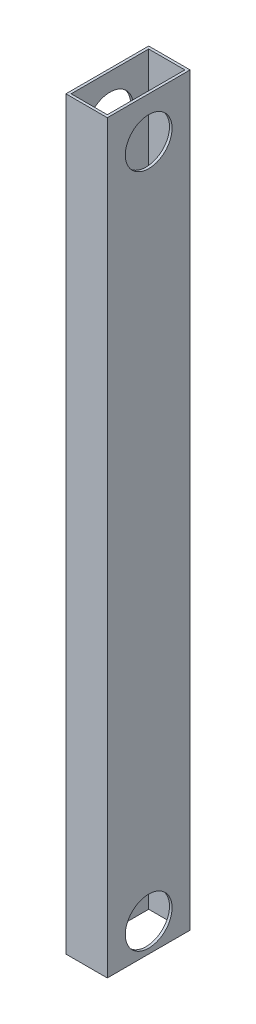
ISO-10303-21;
HEADER;
FILE_DESCRIPTION(('STEP AP214'),'2;1');
FILE_NAME('part.step','',(''),(''),'','','');
FILE_SCHEMA(('AUTOMOTIVE_DESIGN { 1 0 10303 214 1 1 1 1 }'));
ENDSEC;
DATA;
#1=APPLICATION_CONTEXT('core data for automotive mechanical design processes');
#2=APPLICATION_PROTOCOL_DEFINITION('international standard','automotive_design',2000,#1);
#3=PRODUCT_CONTEXT('',#1,'mechanical');
#4=PRODUCT('Part','Part','',(#3));
#5=PRODUCT_RELATED_PRODUCT_CATEGORY('part','',(#4));
#6=PRODUCT_DEFINITION_FORMATION('','',#4);
#7=PRODUCT_DEFINITION_CONTEXT('part definition',#1,'design');
#8=PRODUCT_DEFINITION('design','',#6,#7);
#9=PRODUCT_DEFINITION_SHAPE('','',#8);
#10=(LENGTH_UNIT() NAMED_UNIT(*) SI_UNIT(.MILLI.,.METRE.));
#11=(NAMED_UNIT(*) PLANE_ANGLE_UNIT() SI_UNIT($,.RADIAN.));
#12=(NAMED_UNIT(*) SI_UNIT($,.STERADIAN.) SOLID_ANGLE_UNIT());
#13=UNCERTAINTY_MEASURE_WITH_UNIT(LENGTH_MEASURE(1.E-05),#10,'distance_accuracy_value','');
#14=(GEOMETRIC_REPRESENTATION_CONTEXT(3) GLOBAL_UNCERTAINTY_ASSIGNED_CONTEXT((#13)) GLOBAL_UNIT_ASSIGNED_CONTEXT((#10,
#11,#12)) REPRESENTATION_CONTEXT('',''));
#15=CARTESIAN_POINT('',(0.,0.,0.));
#16=DIRECTION('',(0.,0.,1.));
#17=DIRECTION('',(1.,0.,0.));
#18=AXIS2_PLACEMENT_3D('',#15,#16,#17);
#19=CARTESIAN_POINT('',(0.,457.2,0.));
#20=DIRECTION('',(0.,1.,0.));
#21=DIRECTION('',(0.,0.,1.));
#22=AXIS2_PLACEMENT_3D('',#19,#20,#21);
#23=PLANE('',#22);
#24=DIRECTION('',(0.,0.,1.));
#25=VECTOR('',#24,1.);
#26=CARTESIAN_POINT('',(0.,457.2,0.));
#27=LINE('',#26,#25);
#28=CARTESIAN_POINT('',(0.,457.2,-50.8));
#29=VERTEX_POINT('',#28);
#30=CARTESIAN_POINT('',(0.,457.2,0.));
#31=VERTEX_POINT('',#30);
#32=EDGE_CURVE('E162',#29,#31,#27,.T.);
#33=ORIENTED_EDGE('',*,*,#32,.T.);
#34=DIRECTION('',(1.,0.,0.));
#35=VECTOR('',#34,1.);
#36=CARTESIAN_POINT('',(0.,457.2,0.));
#37=LINE('',#36,#35);
#38=CARTESIAN_POINT('',(25.4,457.2,0.));
#39=VERTEX_POINT('',#38);
#40=EDGE_CURVE('E165',#31,#39,#37,.T.);
#41=ORIENTED_EDGE('',*,*,#40,.T.);
#42=DIRECTION('',(0.,0.,-1.));
#43=VECTOR('',#42,1.);
#44=CARTESIAN_POINT('',(25.4,457.2,0.));
#45=LINE('',#44,#43);
#46=CARTESIAN_POINT('',(25.4,457.2,-50.8));
#47=VERTEX_POINT('',#46);
#48=EDGE_CURVE('E168',#39,#47,#45,.T.);
#49=ORIENTED_EDGE('',*,*,#48,.T.);
#50=DIRECTION('',(-1.,0.,0.));
#51=VECTOR('',#50,1.);
#52=CARTESIAN_POINT('',(0.,457.2,-50.8));
#53=LINE('',#52,#51);
#54=EDGE_CURVE('E170',#47,#29,#53,.T.);
#55=ORIENTED_EDGE('',*,*,#54,.T.);
#56=EDGE_LOOP('',(#33,#41,#49,#55));
#57=FACE_BOUND('',#56,.T.);
#58=DIRECTION('',(1.,0.,0.));
#59=VECTOR('',#58,1.);
#60=CARTESIAN_POINT('',(0.,457.2,-1.5875));
#61=LINE('',#60,#59);
#62=CARTESIAN_POINT('',(1.5875,457.2,-1.5875));
#63=VERTEX_POINT('',#62);
#64=CARTESIAN_POINT('',(23.8125,457.2,-1.5875));
#65=VERTEX_POINT('',#64);
#66=EDGE_CURVE('E132',#63,#65,#61,.T.);
#67=ORIENTED_EDGE('',*,*,#66,.F.);
#68=DIRECTION('',(0.,0.,1.));
#69=VECTOR('',#68,1.);
#70=CARTESIAN_POINT('',(1.5875,457.2,0.));
#71=LINE('',#70,#69);
#72=CARTESIAN_POINT('',(1.5875,457.2,-49.2125));
#73=VERTEX_POINT('',#72);
#74=EDGE_CURVE('E124',#73,#63,#71,.T.);
#75=ORIENTED_EDGE('',*,*,#74,.F.);
#76=DIRECTION('',(-1.,0.,0.));
#77=VECTOR('',#76,1.);
#78=CARTESIAN_POINT('',(0.,457.2,-49.2125));
#79=LINE('',#78,#77);
#80=CARTESIAN_POINT('',(23.8125,457.2,-49.2125));
#81=VERTEX_POINT('',#80);
#82=EDGE_CURVE('E146',#81,#73,#79,.T.);
#83=ORIENTED_EDGE('',*,*,#82,.F.);
#84=DIRECTION('',(0.,0.,-1.));
#85=VECTOR('',#84,1.);
#86=CARTESIAN_POINT('',(23.8125,457.2,0.));
#87=LINE('',#86,#85);
#88=EDGE_CURVE('E144',#65,#81,#87,.T.);
#89=ORIENTED_EDGE('',*,*,#88,.F.);
#90=EDGE_LOOP('',(#67,#75,#83,#89));
#91=FACE_BOUND('',#90,.T.);
#92=ADVANCED_FACE('F57',(#57,#91),#23,.T.);
#93=CARTESIAN_POINT('',(0.,0.,0.));
#94=DIRECTION('',(0.,1.,0.));
#95=DIRECTION('',(0.,0.,1.));
#96=AXIS2_PLACEMENT_3D('',#93,#94,#95);
#97=PLANE('',#96);
#98=DIRECTION('',(0.,0.,1.));
#99=VECTOR('',#98,1.);
#100=CARTESIAN_POINT('',(0.,0.,0.));
#101=LINE('',#100,#99);
#102=CARTESIAN_POINT('',(0.,0.,-50.8));
#103=VERTEX_POINT('',#102);
#104=CARTESIAN_POINT('',(0.,0.,0.));
#105=VERTEX_POINT('',#104);
#106=EDGE_CURVE('E140',#103,#105,#101,.T.);
#107=ORIENTED_EDGE('',*,*,#106,.F.);
#108=DIRECTION('',(-1.,0.,0.));
#109=VECTOR('',#108,1.);
#110=CARTESIAN_POINT('',(0.,0.,-50.8));
#111=LINE('',#110,#109);
#112=CARTESIAN_POINT('',(25.4,0.,-50.8));
#113=VERTEX_POINT('',#112);
#114=EDGE_CURVE('E166',#113,#103,#111,.T.);
#115=ORIENTED_EDGE('',*,*,#114,.F.);
#116=DIRECTION('',(0.,0.,-1.));
#117=VECTOR('',#116,1.);
#118=CARTESIAN_POINT('',(25.4,0.,0.));
#119=LINE('',#118,#117);
#120=CARTESIAN_POINT('',(25.4,0.,0.));
#121=VERTEX_POINT('',#120);
#122=EDGE_CURVE('E177',#121,#113,#119,.T.);
#123=ORIENTED_EDGE('',*,*,#122,.F.);
#124=DIRECTION('',(1.,0.,0.));
#125=VECTOR('',#124,1.);
#126=CARTESIAN_POINT('',(0.,0.,0.));
#127=LINE('',#126,#125);
#128=EDGE_CURVE('E175',#105,#121,#127,.T.);
#129=ORIENTED_EDGE('',*,*,#128,.F.);
#130=EDGE_LOOP('',(#107,#115,#123,#129));
#131=FACE_BOUND('',#130,.T.);
#132=DIRECTION('',(0.,0.,1.));
#133=VECTOR('',#132,1.);
#134=CARTESIAN_POINT('',(1.5875,0.,0.));
#135=LINE('',#134,#133);
#136=CARTESIAN_POINT('',(1.5875,0.,-49.2125));
#137=VERTEX_POINT('',#136);
#138=CARTESIAN_POINT('',(1.5875,0.,-1.5875));
#139=VERTEX_POINT('',#138);
#140=EDGE_CURVE('E82',#137,#139,#135,.T.);
#141=ORIENTED_EDGE('',*,*,#140,.T.);
#142=DIRECTION('',(1.,0.,0.));
#143=VECTOR('',#142,1.);
#144=CARTESIAN_POINT('',(0.,0.,-1.5875));
#145=LINE('',#144,#143);
#146=CARTESIAN_POINT('',(23.8125,0.,-1.5875));
#147=VERTEX_POINT('',#146);
#148=EDGE_CURVE('E139',#139,#147,#145,.T.);
#149=ORIENTED_EDGE('',*,*,#148,.T.);
#150=DIRECTION('',(0.,0.,-1.));
#151=VECTOR('',#150,1.);
#152=CARTESIAN_POINT('',(23.8125,0.,0.));
#153=LINE('',#152,#151);
#154=CARTESIAN_POINT('',(23.8125,0.,-49.2125));
#155=VERTEX_POINT('',#154);
#156=EDGE_CURVE('E154',#147,#155,#153,.T.);
#157=ORIENTED_EDGE('',*,*,#156,.T.);
#158=DIRECTION('',(-1.,0.,0.));
#159=VECTOR('',#158,1.);
#160=CARTESIAN_POINT('',(0.,0.,-49.2125));
#161=LINE('',#160,#159);
#162=EDGE_CURVE('E133',#155,#137,#161,.T.);
#163=ORIENTED_EDGE('',*,*,#162,.T.);
#164=EDGE_LOOP('',(#141,#149,#157,#163));
#165=FACE_BOUND('',#164,.T.);
#166=ADVANCED_FACE('F224',(#131,#165),#97,.F.);
#167=CARTESIAN_POINT('',(0.,457.2,0.));
#168=DIRECTION('',(1.,0.,0.));
#169=DIRECTION('',(0.,0.,-1.));
#170=AXIS2_PLACEMENT_3D('',#167,#168,#169);
#171=PLANE('',#170);
#172=CARTESIAN_POINT('',(0.,431.8,-25.4));
#173=DIRECTION('',(1.,0.,0.));
#174=DIRECTION('',(0.,0.,-1.));
#175=AXIS2_PLACEMENT_3D('',#172,#173,#174);
#176=CIRCLE('',#175,14.351);
#177=CARTESIAN_POINT('',(0.,431.8,-39.751));
#178=VERTEX_POINT('',#177);
#179=EDGE_CURVE('E206',#178,#178,#176,.T.);
#180=ORIENTED_EDGE('',*,*,#179,.T.);
#181=EDGE_LOOP('',(#180));
#182=FACE_BOUND('',#181,.T.);
#183=CARTESIAN_POINT('',(0.,17.526,-25.4));
#184=DIRECTION('',(1.,0.,0.));
#185=DIRECTION('',(0.,0.,-1.));
#186=AXIS2_PLACEMENT_3D('',#183,#184,#185);
#187=CIRCLE('',#186,14.351);
#188=CARTESIAN_POINT('',(0.,17.526,-39.751));
#189=VERTEX_POINT('',#188);
#190=EDGE_CURVE('E188',#189,#189,#187,.T.);
#191=ORIENTED_EDGE('',*,*,#190,.T.);
#192=EDGE_LOOP('',(#191));
#193=FACE_BOUND('',#192,.T.);
#194=ORIENTED_EDGE('',*,*,#106,.T.);
#195=DIRECTION('',(0.,-1.,0.));
#196=VECTOR('',#195,1.);
#197=CARTESIAN_POINT('',(0.,457.2,0.));
#198=LINE('',#197,#196);
#199=EDGE_CURVE('E12',#31,#105,#198,.T.);
#200=ORIENTED_EDGE('',*,*,#199,.F.);
#201=ORIENTED_EDGE('',*,*,#32,.F.);
#202=DIRECTION('',(0.,-1.,0.));
#203=VECTOR('',#202,1.);
#204=CARTESIAN_POINT('',(0.,457.2,-50.8));
#205=LINE('',#204,#203);
#206=EDGE_CURVE('E172',#29,#103,#205,.T.);
#207=ORIENTED_EDGE('',*,*,#206,.T.);
#208=EDGE_LOOP('',(#194,#200,#201,#207));
#209=FACE_BOUND('',#208,.T.);
#210=ADVANCED_FACE('F59',(#182,#193,#209),#171,.F.);
#211=CARTESIAN_POINT('',(0.,457.2,0.));
#212=DIRECTION('',(0.,0.,-1.));
#213=DIRECTION('',(-1.,0.,0.));
#214=AXIS2_PLACEMENT_3D('',#211,#212,#213);
#215=PLANE('',#214);
#216=ORIENTED_EDGE('',*,*,#128,.T.);
#217=DIRECTION('',(0.,-1.,0.));
#218=VECTOR('',#217,1.);
#219=CARTESIAN_POINT('',(25.4,457.2,0.));
#220=LINE('',#219,#218);
#221=EDGE_CURVE('E66',#39,#121,#220,.T.);
#222=ORIENTED_EDGE('',*,*,#221,.F.);
#223=ORIENTED_EDGE('',*,*,#40,.F.);
#224=ORIENTED_EDGE('',*,*,#199,.T.);
#225=EDGE_LOOP('',(#216,#222,#223,#224));
#226=FACE_BOUND('',#225,.T.);
#227=ADVANCED_FACE('F250',(#226),#215,.F.);
#228=CARTESIAN_POINT('',(25.4,457.2,0.));
#229=DIRECTION('',(-1.,0.,0.));
#230=DIRECTION('',(0.,0.,1.));
#231=AXIS2_PLACEMENT_3D('',#228,#229,#230);
#232=PLANE('',#231);
#233=CARTESIAN_POINT('',(25.4,431.8,-25.4));
#234=DIRECTION('',(1.,0.,0.));
#235=DIRECTION('',(0.,0.,-1.));
#236=AXIS2_PLACEMENT_3D('',#233,#234,#235);
#237=CIRCLE('',#236,14.351);
#238=CARTESIAN_POINT('',(25.4,431.8,-39.751));
#239=VERTEX_POINT('',#238);
#240=EDGE_CURVE('E203',#239,#239,#237,.T.);
#241=ORIENTED_EDGE('',*,*,#240,.F.);
#242=EDGE_LOOP('',(#241));
#243=FACE_BOUND('',#242,.T.);
#244=CARTESIAN_POINT('',(25.4,17.526,-25.4));
#245=DIRECTION('',(1.,0.,0.));
#246=DIRECTION('',(0.,0.,-1.));
#247=AXIS2_PLACEMENT_3D('',#244,#245,#246);
#248=CIRCLE('',#247,14.351);
#249=CARTESIAN_POINT('',(25.4,17.526,-39.751));
#250=VERTEX_POINT('',#249);
#251=EDGE_CURVE('E193',#250,#250,#248,.T.);
#252=ORIENTED_EDGE('',*,*,#251,.F.);
#253=EDGE_LOOP('',(#252));
#254=FACE_BOUND('',#253,.T.);
#255=ORIENTED_EDGE('',*,*,#122,.T.);
#256=DIRECTION('',(0.,-1.,0.));
#257=VECTOR('',#256,1.);
#258=CARTESIAN_POINT('',(25.4,457.2,-50.8));
#259=LINE('',#258,#257);
#260=EDGE_CURVE('E182',#47,#113,#259,.T.);
#261=ORIENTED_EDGE('',*,*,#260,.F.);
#262=ORIENTED_EDGE('',*,*,#48,.F.);
#263=ORIENTED_EDGE('',*,*,#221,.T.);
#264=EDGE_LOOP('',(#255,#261,#262,#263));
#265=FACE_BOUND('',#264,.T.);
#266=ADVANCED_FACE('F247',(#243,#254,#265),#232,.F.);
#267=CARTESIAN_POINT('',(0.,457.2,-50.8));
#268=DIRECTION('',(0.,0.,1.));
#269=DIRECTION('',(1.,0.,0.));
#270=AXIS2_PLACEMENT_3D('',#267,#268,#269);
#271=PLANE('',#270);
#272=ORIENTED_EDGE('',*,*,#114,.T.);
#273=ORIENTED_EDGE('',*,*,#206,.F.);
#274=ORIENTED_EDGE('',*,*,#54,.F.);
#275=ORIENTED_EDGE('',*,*,#260,.T.);
#276=EDGE_LOOP('',(#272,#273,#274,#275));
#277=FACE_BOUND('',#276,.T.);
#278=ADVANCED_FACE('F244',(#277),#271,.F.);
#279=CARTESIAN_POINT('',(1.5875,457.2,0.));
#280=DIRECTION('',(1.,0.,0.));
#281=DIRECTION('',(0.,0.,-1.));
#282=AXIS2_PLACEMENT_3D('',#279,#280,#281);
#283=PLANE('',#282);
#284=CARTESIAN_POINT('',(1.5875,431.8,-25.4));
#285=DIRECTION('',(1.,0.,0.));
#286=DIRECTION('',(0.,0.,-1.));
#287=AXIS2_PLACEMENT_3D('',#284,#285,#286);
#288=CIRCLE('',#287,14.351);
#289=CARTESIAN_POINT('',(1.5875,431.8,-39.751));
#290=VERTEX_POINT('',#289);
#291=EDGE_CURVE('E198',#290,#290,#288,.T.);
#292=ORIENTED_EDGE('',*,*,#291,.F.);
#293=EDGE_LOOP('',(#292));
#294=FACE_BOUND('',#293,.T.);
#295=CARTESIAN_POINT('',(1.5875,17.526,-25.4));
#296=DIRECTION('',(1.,0.,0.));
#297=DIRECTION('',(0.,0.,-1.));
#298=AXIS2_PLACEMENT_3D('',#295,#296,#297);
#299=CIRCLE('',#298,14.351);
#300=CARTESIAN_POINT('',(1.5875,17.526,-39.751));
#301=VERTEX_POINT('',#300);
#302=EDGE_CURVE('E152',#301,#301,#299,.T.);
#303=ORIENTED_EDGE('',*,*,#302,.F.);
#304=EDGE_LOOP('',(#303));
#305=FACE_BOUND('',#304,.T.);
#306=ORIENTED_EDGE('',*,*,#140,.F.);
#307=DIRECTION('',(0.,-1.,0.));
#308=VECTOR('',#307,1.);
#309=CARTESIAN_POINT('',(1.5875,457.2,-49.2125));
#310=LINE('',#309,#308);
#311=EDGE_CURVE('E128',#73,#137,#310,.T.);
#312=ORIENTED_EDGE('',*,*,#311,.F.);
#313=ORIENTED_EDGE('',*,*,#74,.T.);
#314=DIRECTION('',(0.,-1.,0.));
#315=VECTOR('',#314,1.);
#316=CARTESIAN_POINT('',(1.5875,457.2,-1.5875));
#317=LINE('',#316,#315);
#318=EDGE_CURVE('E127',#63,#139,#317,.T.);
#319=ORIENTED_EDGE('',*,*,#318,.T.);
#320=EDGE_LOOP('',(#306,#312,#313,#319));
#321=FACE_BOUND('',#320,.T.);
#322=ADVANCED_FACE('F126',(#294,#305,#321),#283,.T.);
#323=CARTESIAN_POINT('',(0.,457.2,-1.5875));
#324=DIRECTION('',(0.,0.,-1.));
#325=DIRECTION('',(-1.,0.,0.));
#326=AXIS2_PLACEMENT_3D('',#323,#324,#325);
#327=PLANE('',#326);
#328=ORIENTED_EDGE('',*,*,#148,.F.);
#329=ORIENTED_EDGE('',*,*,#318,.F.);
#330=ORIENTED_EDGE('',*,*,#66,.T.);
#331=DIRECTION('',(0.,-1.,0.));
#332=VECTOR('',#331,1.);
#333=CARTESIAN_POINT('',(23.8125,457.2,-1.5875));
#334=LINE('',#333,#332);
#335=EDGE_CURVE('E141',#65,#147,#334,.T.);
#336=ORIENTED_EDGE('',*,*,#335,.T.);
#337=EDGE_LOOP('',(#328,#329,#330,#336));
#338=FACE_BOUND('',#337,.T.);
#339=ADVANCED_FACE('F136',(#338),#327,.T.);
#340=CARTESIAN_POINT('',(23.8125,457.2,0.));
#341=DIRECTION('',(-1.,0.,0.));
#342=DIRECTION('',(0.,0.,1.));
#343=AXIS2_PLACEMENT_3D('',#340,#341,#342);
#344=PLANE('',#343);
#345=CARTESIAN_POINT('',(23.8125,431.8,-25.4));
#346=DIRECTION('',(-1.,0.,0.));
#347=DIRECTION('',(0.,0.,1.));
#348=AXIS2_PLACEMENT_3D('',#345,#346,#347);
#349=CIRCLE('',#348,14.351);
#350=CARTESIAN_POINT('',(23.8125,431.8,-11.049));
#351=VERTEX_POINT('',#350);
#352=EDGE_CURVE('E61',#351,#351,#349,.T.);
#353=ORIENTED_EDGE('',*,*,#352,.F.);
#354=EDGE_LOOP('',(#353));
#355=FACE_BOUND('',#354,.T.);
#356=CARTESIAN_POINT('',(23.8125,17.526,-25.4));
#357=DIRECTION('',(-1.,0.,0.));
#358=DIRECTION('',(0.,0.,1.));
#359=AXIS2_PLACEMENT_3D('',#356,#357,#358);
#360=CIRCLE('',#359,14.351);
#361=CARTESIAN_POINT('',(23.8125,17.526,-11.049));
#362=VERTEX_POINT('',#361);
#363=EDGE_CURVE('E186',#362,#362,#360,.T.);
#364=ORIENTED_EDGE('',*,*,#363,.F.);
#365=EDGE_LOOP('',(#364));
#366=FACE_BOUND('',#365,.T.);
#367=ORIENTED_EDGE('',*,*,#156,.F.);
#368=ORIENTED_EDGE('',*,*,#335,.F.);
#369=ORIENTED_EDGE('',*,*,#88,.T.);
#370=DIRECTION('',(0.,-1.,0.));
#371=VECTOR('',#370,1.);
#372=CARTESIAN_POINT('',(23.8125,457.2,-49.2125));
#373=LINE('',#372,#371);
#374=EDGE_CURVE('E74',#81,#155,#373,.T.);
#375=ORIENTED_EDGE('',*,*,#374,.T.);
#376=EDGE_LOOP('',(#367,#368,#369,#375));
#377=FACE_BOUND('',#376,.T.);
#378=ADVANCED_FACE('F216',(#355,#366,#377),#344,.T.);
#379=CARTESIAN_POINT('',(0.,457.2,-49.2125));
#380=DIRECTION('',(0.,0.,1.));
#381=DIRECTION('',(1.,0.,0.));
#382=AXIS2_PLACEMENT_3D('',#379,#380,#381);
#383=PLANE('',#382);
#384=ORIENTED_EDGE('',*,*,#162,.F.);
#385=ORIENTED_EDGE('',*,*,#374,.F.);
#386=ORIENTED_EDGE('',*,*,#82,.T.);
#387=ORIENTED_EDGE('',*,*,#311,.T.);
#388=EDGE_LOOP('',(#384,#385,#386,#387));
#389=FACE_BOUND('',#388,.T.);
#390=ADVANCED_FACE('F219',(#389),#383,.T.);
#391=CARTESIAN_POINT('',(0.,17.526,-25.4));
#392=DIRECTION('',(1.,0.,0.));
#393=DIRECTION('',(0.,0.,-1.));
#394=AXIS2_PLACEMENT_3D('',#391,#392,#393);
#395=CYLINDRICAL_SURFACE('',#394,14.351);
#396=ORIENTED_EDGE('',*,*,#363,.T.);
#397=EDGE_LOOP('',(#396));
#398=FACE_BOUND('',#397,.T.);
#399=ORIENTED_EDGE('',*,*,#251,.T.);
#400=EDGE_LOOP('',(#399));
#401=FACE_BOUND('',#400,.T.);
#402=ADVANCED_FACE('F226',(#398,#401),#395,.F.);
#403=ORIENTED_EDGE('',*,*,#302,.T.);
#404=EDGE_LOOP('',(#403));
#405=FACE_BOUND('',#404,.T.);
#406=ORIENTED_EDGE('',*,*,#190,.F.);
#407=EDGE_LOOP('',(#406));
#408=FACE_BOUND('',#407,.T.);
#409=ADVANCED_FACE('F231',(#405,#408),#395,.F.);
#410=CARTESIAN_POINT('',(0.,431.8,-25.4));
#411=DIRECTION('',(1.,0.,0.));
#412=DIRECTION('',(0.,0.,-1.));
#413=AXIS2_PLACEMENT_3D('',#410,#411,#412);
#414=CYLINDRICAL_SURFACE('',#413,14.351);
#415=ORIENTED_EDGE('',*,*,#352,.T.);
#416=EDGE_LOOP('',(#415));
#417=FACE_BOUND('',#416,.T.);
#418=ORIENTED_EDGE('',*,*,#240,.T.);
#419=EDGE_LOOP('',(#418));
#420=FACE_BOUND('',#419,.T.);
#421=ADVANCED_FACE('F213',(#417,#420),#414,.F.);
#422=ORIENTED_EDGE('',*,*,#291,.T.);
#423=EDGE_LOOP('',(#422));
#424=FACE_BOUND('',#423,.T.);
#425=ORIENTED_EDGE('',*,*,#179,.F.);
#426=EDGE_LOOP('',(#425));
#427=FACE_BOUND('',#426,.T.);
#428=ADVANCED_FACE('F328',(#424,#427),#414,.F.);
#429=CLOSED_SHELL('',(#92,#166,#210,#227,#266,#278,#322,#339,#378,#390,#402,#409,#421,#428));
#430=MANIFOLD_SOLID_BREP('B2',#429);
#431=ADVANCED_BREP_SHAPE_REPRESENTATION('',(#18,#430),#14);
#432=SHAPE_DEFINITION_REPRESENTATION(#9,#431);
ENDSEC;
END-ISO-10303-21;
